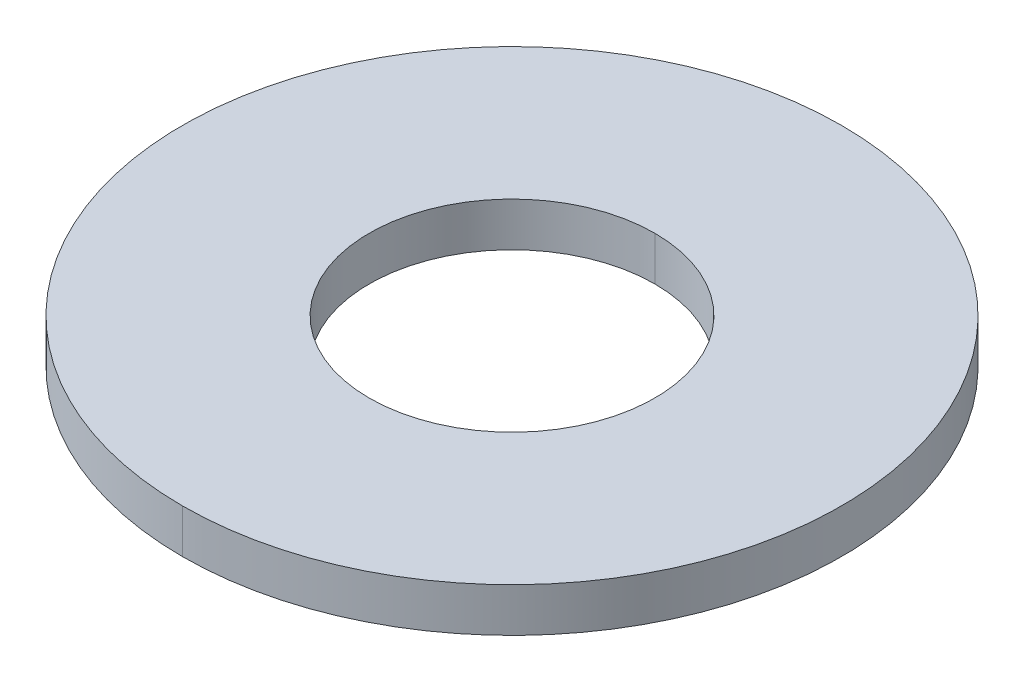
ISO-10303-21;
HEADER;
FILE_DESCRIPTION(('STEP AP214'),'2;1');
FILE_NAME('part.step','',(''),(''),'','','');
FILE_SCHEMA(('AUTOMOTIVE_DESIGN { 1 0 10303 214 1 1 1 1 }'));
ENDSEC;
DATA;
#1=APPLICATION_CONTEXT('core data for automotive mechanical design processes');
#2=APPLICATION_PROTOCOL_DEFINITION('international standard','automotive_design',2000,#1);
#3=PRODUCT_CONTEXT('',#1,'mechanical');
#4=PRODUCT('Part','Part','',(#3));
#5=PRODUCT_RELATED_PRODUCT_CATEGORY('part','',(#4));
#6=PRODUCT_DEFINITION_FORMATION('','',#4);
#7=PRODUCT_DEFINITION_CONTEXT('part definition',#1,'design');
#8=PRODUCT_DEFINITION('design','',#6,#7);
#9=PRODUCT_DEFINITION_SHAPE('','',#8);
#10=(LENGTH_UNIT() NAMED_UNIT(*) SI_UNIT(.MILLI.,.METRE.));
#11=(NAMED_UNIT(*) PLANE_ANGLE_UNIT() SI_UNIT($,.RADIAN.));
#12=(NAMED_UNIT(*) SI_UNIT($,.STERADIAN.) SOLID_ANGLE_UNIT());
#13=UNCERTAINTY_MEASURE_WITH_UNIT(LENGTH_MEASURE(1.E-05),#10,'distance_accuracy_value','');
#14=(GEOMETRIC_REPRESENTATION_CONTEXT(3) GLOBAL_UNCERTAINTY_ASSIGNED_CONTEXT((#13)) GLOBAL_UNIT_ASSIGNED_CONTEXT((#10,
#11,#12)) REPRESENTATION_CONTEXT('',''));
#15=CARTESIAN_POINT('',(0.,0.,0.));
#16=DIRECTION('',(0.,0.,1.));
#17=DIRECTION('',(1.,0.,0.));
#18=AXIS2_PLACEMENT_3D('',#15,#16,#17);
#19=CARTESIAN_POINT('',(0.,1.,0.));
#20=DIRECTION('',(0.,-1.,0.));
#21=DIRECTION('',(0.,0.,-1.));
#22=AXIS2_PLACEMENT_3D('',#19,#20,#21);
#23=CYLINDRICAL_SURFACE('',#22,3.25);
#24=DIRECTION('',(0.,-1.,0.));
#25=VECTOR('',#24,1.);
#26=CARTESIAN_POINT('',(0.,1.,3.25));
#27=LINE('',#26,#25);
#28=CARTESIAN_POINT('',(0.,1.,3.25));
#29=VERTEX_POINT('',#28);
#30=CARTESIAN_POINT('',(0.,0.,3.25));
#31=VERTEX_POINT('',#30);
#32=EDGE_CURVE('E77',#29,#31,#27,.T.);
#33=ORIENTED_EDGE('',*,*,#32,.F.);
#34=CARTESIAN_POINT('',(0.,1.,0.));
#35=DIRECTION('',(0.,1.,0.));
#36=DIRECTION('',(0.,0.,1.));
#37=AXIS2_PLACEMENT_3D('',#34,#35,#36);
#38=CIRCLE('',#37,3.25);
#39=CARTESIAN_POINT('',(0.,1.,-3.25));
#40=VERTEX_POINT('',#39);
#41=EDGE_CURVE('E65',#29,#40,#38,.T.);
#42=ORIENTED_EDGE('',*,*,#41,.T.);
#43=DIRECTION('',(0.,-1.,0.));
#44=VECTOR('',#43,1.);
#45=CARTESIAN_POINT('',(0.,1.,-3.25));
#46=LINE('',#45,#44);
#47=CARTESIAN_POINT('',(0.,0.,-3.25));
#48=VERTEX_POINT('',#47);
#49=EDGE_CURVE('E74',#40,#48,#46,.T.);
#50=ORIENTED_EDGE('',*,*,#49,.T.);
#51=CARTESIAN_POINT('',(0.,0.,0.));
#52=DIRECTION('',(0.,1.,0.));
#53=DIRECTION('',(0.,0.,1.));
#54=AXIS2_PLACEMENT_3D('',#51,#52,#53);
#55=CIRCLE('',#54,3.25);
#56=EDGE_CURVE('E11',#31,#48,#55,.T.);
#57=ORIENTED_EDGE('',*,*,#56,.F.);
#58=EDGE_LOOP('',(#33,#42,#50,#57));
#59=FACE_BOUND('',#58,.T.);
#60=ADVANCED_FACE('F16',(#59),#23,.F.);
#61=CARTESIAN_POINT('',(0.,1.,0.));
#62=DIRECTION('',(0.,-1.,0.));
#63=DIRECTION('',(0.,0.,-1.));
#64=AXIS2_PLACEMENT_3D('',#61,#62,#63);
#65=CYLINDRICAL_SURFACE('',#64,7.5);
#66=DIRECTION('',(0.,-1.,0.));
#67=VECTOR('',#66,1.);
#68=CARTESIAN_POINT('',(0.,1.,7.5));
#69=LINE('',#68,#67);
#70=CARTESIAN_POINT('',(0.,1.,7.5));
#71=VERTEX_POINT('',#70);
#72=CARTESIAN_POINT('',(0.,0.,7.5));
#73=VERTEX_POINT('',#72);
#74=EDGE_CURVE('E103',#71,#73,#69,.T.);
#75=ORIENTED_EDGE('',*,*,#74,.F.);
#76=CARTESIAN_POINT('',(0.,1.,0.));
#77=DIRECTION('',(0.,1.,0.));
#78=DIRECTION('',(0.,0.,1.));
#79=AXIS2_PLACEMENT_3D('',#76,#77,#78);
#80=CIRCLE('',#79,7.5);
#81=CARTESIAN_POINT('',(0.,1.,-7.5));
#82=VERTEX_POINT('',#81);
#83=EDGE_CURVE('E80',#82,#71,#80,.T.);
#84=ORIENTED_EDGE('',*,*,#83,.F.);
#85=DIRECTION('',(0.,-1.,0.));
#86=VECTOR('',#85,1.);
#87=CARTESIAN_POINT('',(0.,1.,-7.5));
#88=LINE('',#87,#86);
#89=CARTESIAN_POINT('',(0.,0.,-7.5));
#90=VERTEX_POINT('',#89);
#91=EDGE_CURVE('E108',#82,#90,#88,.T.);
#92=ORIENTED_EDGE('',*,*,#91,.T.);
#93=CARTESIAN_POINT('',(0.,0.,0.));
#94=DIRECTION('',(0.,1.,0.));
#95=DIRECTION('',(0.,0.,1.));
#96=AXIS2_PLACEMENT_3D('',#93,#94,#95);
#97=CIRCLE('',#96,7.5);
#98=EDGE_CURVE('E27',#90,#73,#97,.T.);
#99=ORIENTED_EDGE('',*,*,#98,.T.);
#100=EDGE_LOOP('',(#75,#84,#92,#99));
#101=FACE_BOUND('',#100,.T.);
#102=ADVANCED_FACE('F18',(#101),#65,.T.);
#103=CARTESIAN_POINT('',(0.,0.,0.));
#104=DIRECTION('',(0.,1.,0.));
#105=DIRECTION('',(1.,0.,0.));
#106=AXIS2_PLACEMENT_3D('',#103,#104,#105);
#107=PLANE('',#106);
#108=CARTESIAN_POINT('',(0.,0.,0.));
#109=DIRECTION('',(0.,1.,0.));
#110=DIRECTION('',(0.,0.,1.));
#111=AXIS2_PLACEMENT_3D('',#108,#109,#110);
#112=CIRCLE('',#111,3.25);
#113=EDGE_CURVE('E85',#48,#31,#112,.T.);
#114=ORIENTED_EDGE('',*,*,#113,.T.);
#115=ORIENTED_EDGE('',*,*,#56,.T.);
#116=EDGE_LOOP('',(#114,#115));
#117=FACE_BOUND('',#116,.T.);
#118=ORIENTED_EDGE('',*,*,#98,.F.);
#119=CARTESIAN_POINT('',(0.,0.,0.));
#120=DIRECTION('',(0.,1.,0.));
#121=DIRECTION('',(0.,0.,1.));
#122=AXIS2_PLACEMENT_3D('',#119,#120,#121);
#123=CIRCLE('',#122,7.5);
#124=EDGE_CURVE('E105',#73,#90,#123,.T.);
#125=ORIENTED_EDGE('',*,*,#124,.F.);
#126=EDGE_LOOP('',(#118,#125));
#127=FACE_BOUND('',#126,.T.);
#128=ADVANCED_FACE('F124',(#117,#127),#107,.F.);
#129=CARTESIAN_POINT('',(0.,1.,0.));
#130=DIRECTION('',(0.,1.,0.));
#131=DIRECTION('',(1.,0.,0.));
#132=AXIS2_PLACEMENT_3D('',#129,#130,#131);
#133=PLANE('',#132);
#134=CARTESIAN_POINT('',(0.,1.,0.));
#135=DIRECTION('',(0.,1.,0.));
#136=DIRECTION('',(0.,0.,1.));
#137=AXIS2_PLACEMENT_3D('',#134,#135,#136);
#138=CIRCLE('',#137,3.25);
#139=EDGE_CURVE('E20',#40,#29,#138,.T.);
#140=ORIENTED_EDGE('',*,*,#139,.F.);
#141=ORIENTED_EDGE('',*,*,#41,.F.);
#142=EDGE_LOOP('',(#140,#141));
#143=FACE_BOUND('',#142,.T.);
#144=ORIENTED_EDGE('',*,*,#83,.T.);
#145=CARTESIAN_POINT('',(0.,1.,0.));
#146=DIRECTION('',(0.,1.,0.));
#147=DIRECTION('',(0.,0.,1.));
#148=AXIS2_PLACEMENT_3D('',#145,#146,#147);
#149=CIRCLE('',#148,7.5);
#150=EDGE_CURVE('E87',#71,#82,#149,.T.);
#151=ORIENTED_EDGE('',*,*,#150,.T.);
#152=EDGE_LOOP('',(#144,#151));
#153=FACE_BOUND('',#152,.T.);
#154=ADVANCED_FACE('F89',(#143,#153),#133,.T.);
#155=CARTESIAN_POINT('',(0.,1.,0.));
#156=DIRECTION('',(0.,-1.,0.));
#157=DIRECTION('',(0.,0.,-1.));
#158=AXIS2_PLACEMENT_3D('',#155,#156,#157);
#159=CYLINDRICAL_SURFACE('',#158,7.5);
#160=ORIENTED_EDGE('',*,*,#150,.F.);
#161=ORIENTED_EDGE('',*,*,#74,.T.);
#162=ORIENTED_EDGE('',*,*,#124,.T.);
#163=ORIENTED_EDGE('',*,*,#91,.F.);
#164=EDGE_LOOP('',(#160,#161,#162,#163));
#165=FACE_BOUND('',#164,.T.);
#166=ADVANCED_FACE('F126',(#165),#159,.T.);
#167=CARTESIAN_POINT('',(0.,1.,0.));
#168=DIRECTION('',(0.,-1.,0.));
#169=DIRECTION('',(0.,0.,-1.));
#170=AXIS2_PLACEMENT_3D('',#167,#168,#169);
#171=CYLINDRICAL_SURFACE('',#170,3.25);
#172=ORIENTED_EDGE('',*,*,#139,.T.);
#173=ORIENTED_EDGE('',*,*,#32,.T.);
#174=ORIENTED_EDGE('',*,*,#113,.F.);
#175=ORIENTED_EDGE('',*,*,#49,.F.);
#176=EDGE_LOOP('',(#172,#173,#174,#175));
#177=FACE_BOUND('',#176,.T.);
#178=ADVANCED_FACE('F83',(#177),#171,.F.);
#179=CLOSED_SHELL('',(#60,#102,#128,#154,#166,#178));
#180=MANIFOLD_SOLID_BREP('B1',#179);
#181=ADVANCED_BREP_SHAPE_REPRESENTATION('',(#18,#180),#14);
#182=SHAPE_DEFINITION_REPRESENTATION(#9,#181);
ENDSEC;
END-ISO-10303-21;
